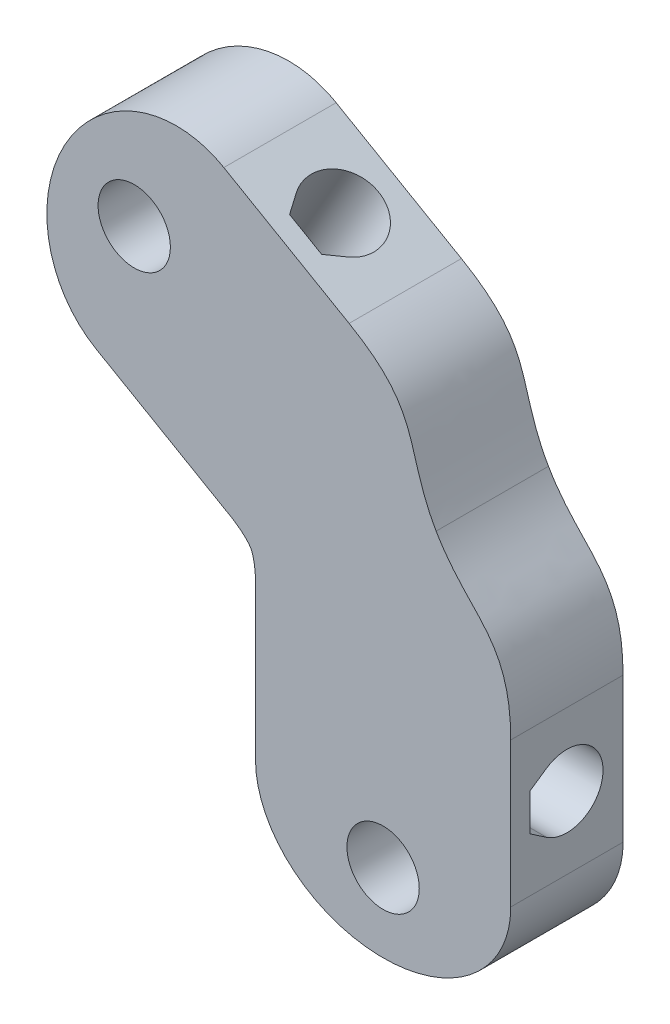
ISO-10303-21;
HEADER;
FILE_DESCRIPTION(('STEP AP214'),'2;1');
FILE_NAME('part.step','',(''),(''),'','','');
FILE_SCHEMA(('AUTOMOTIVE_DESIGN { 1 0 10303 214 1 1 1 1 }'));
ENDSEC;
DATA;
#1=APPLICATION_CONTEXT('core data for automotive mechanical design processes');
#2=APPLICATION_PROTOCOL_DEFINITION('international standard','automotive_design',2000,#1);
#3=PRODUCT_CONTEXT('',#1,'mechanical');
#4=PRODUCT('Part','Part','',(#3));
#5=PRODUCT_RELATED_PRODUCT_CATEGORY('part','',(#4));
#6=PRODUCT_DEFINITION_FORMATION('','',#4);
#7=PRODUCT_DEFINITION_CONTEXT('part definition',#1,'design');
#8=PRODUCT_DEFINITION('design','',#6,#7);
#9=PRODUCT_DEFINITION_SHAPE('','',#8);
#10=(LENGTH_UNIT() NAMED_UNIT(*) SI_UNIT(.MILLI.,.METRE.));
#11=(NAMED_UNIT(*) PLANE_ANGLE_UNIT() SI_UNIT($,.RADIAN.));
#12=(NAMED_UNIT(*) SI_UNIT($,.STERADIAN.) SOLID_ANGLE_UNIT());
#13=UNCERTAINTY_MEASURE_WITH_UNIT(LENGTH_MEASURE(1.E-05),#10,'distance_accuracy_value','');
#14=(GEOMETRIC_REPRESENTATION_CONTEXT(3) GLOBAL_UNCERTAINTY_ASSIGNED_CONTEXT((#13)) GLOBAL_UNIT_ASSIGNED_CONTEXT((#10,
#11,#12)) REPRESENTATION_CONTEXT('',''));
#15=CARTESIAN_POINT('',(0.,0.,0.));
#16=DIRECTION('',(0.,0.,1.));
#17=DIRECTION('',(1.,0.,0.));
#18=AXIS2_PLACEMENT_3D('',#15,#16,#17);
#19=CARTESIAN_POINT('',(0.,-30.2749907475931,6.6));
#20=DIRECTION('',(0.,0.,1.));
#21=DIRECTION('',(1.,0.,0.));
#22=AXIS2_PLACEMENT_3D('',#19,#20,#21);
#23=PLANE('',#22);
#24=DIRECTION('',(0.,-1.,0.));
#25=VECTOR('',#24,1.);
#26=CARTESIAN_POINT('',(-15.,-13.2749907475931,6.6));
#27=LINE('',#26,#25);
#28=CARTESIAN_POINT('',(-15.,-13.2749907475931,6.6));
#29=VERTEX_POINT('',#28);
#30=CARTESIAN_POINT('',(-15.,-30.2749907475931,6.6));
#31=VERTEX_POINT('',#30);
#32=EDGE_CURVE('E343',#29,#31,#27,.T.);
#33=ORIENTED_EDGE('',*,*,#32,.T.);
#34=CARTESIAN_POINT('',(0.,-30.2749907475931,6.6));
#35=DIRECTION('',(0.,0.,1.));
#36=DIRECTION('',(1.,0.,0.));
#37=AXIS2_PLACEMENT_3D('',#34,#35,#36);
#38=ELLIPSE('',#37,15.,12.681);
#39=CARTESIAN_POINT('',(15.,-30.2749907475932,6.6));
#40=VERTEX_POINT('',#39);
#41=EDGE_CURVE('E346',#31,#40,#38,.T.);
#42=ORIENTED_EDGE('',*,*,#41,.T.);
#43=DIRECTION('',(0.,-1.,0.));
#44=VECTOR('',#43,1.);
#45=CARTESIAN_POINT('',(15.,-13.2749907475933,6.6));
#46=LINE('',#45,#44);
#47=CARTESIAN_POINT('',(15.,-13.2749907475933,6.6));
#48=VERTEX_POINT('',#47);
#49=EDGE_CURVE('E350',#48,#40,#46,.T.);
#50=ORIENTED_EDGE('',*,*,#49,.F.);
#51=CARTESIAN_POINT('',(15.,-13.2749907475933,6.6));
#52=CARTESIAN_POINT('',(15.,-3.02796405891336,6.6));
#53=CARTESIAN_POINT('',(10.1063570974954,-3.10451473088878,6.6));
#54=CARTESIAN_POINT('',(6.2354735114352,3.60005231035195,6.6));
#55=B_SPLINE_CURVE_WITH_KNOTS('',3,(#51,#52,#53,#54),.UNSPECIFIED.,.F.,.F.,(4,4),(0.,1.),.UNSPECIFIED.);
#56=CARTESIAN_POINT('',(6.23547351143524,3.60005231035187,6.6));
#57=VERTEX_POINT('',#56);
#58=EDGE_CURVE('E367',#48,#57,#55,.T.);
#59=ORIENTED_EDGE('',*,*,#58,.T.);
#60=CARTESIAN_POINT('',(-3.99647922241902,19.6278764305633,6.6));
#61=CARTESIAN_POINT('',(4.87770620323494,14.5043630862233,6.6));
#62=CARTESIAN_POINT('',(2.36458992537499,10.3046193515926,6.6));
#63=CARTESIAN_POINT('',(6.23547351143524,3.60005231035187,6.6));
#64=B_SPLINE_CURVE_WITH_KNOTS('',3,(#60,#61,#62,#63),.UNSPECIFIED.,.F.,.F.,(4,4),(0.,1.),.UNSPECIFIED.);
#65=CARTESIAN_POINT('',(-3.99647922241902,19.6278764305633,6.6));
#66=VERTEX_POINT('',#65);
#67=EDGE_CURVE('E371',#66,#57,#64,.T.);
#68=ORIENTED_EDGE('',*,*,#67,.F.);
#69=DIRECTION('',(-0.866025403784441,0.499999999999996,0.));
#70=VECTOR('',#69,1.);
#71=CARTESIAN_POINT('',(-3.99647922241902,19.6278764305633,6.6));
#72=LINE('',#71,#70);
#73=CARTESIAN_POINT('',(-18.7189110867546,28.1278764305632,6.6));
#74=VERTEX_POINT('',#73);
#75=EDGE_CURVE('E380',#66,#74,#72,.T.);
#76=ORIENTED_EDGE('',*,*,#75,.T.);
#77=CARTESIAN_POINT('',(-26.2189110867545,15.1374953737965,6.6));
#78=DIRECTION('',(0.,0.,-1.));
#79=DIRECTION('',(0.49999999999999,0.866025403784445,0.));
#80=AXIS2_PLACEMENT_3D('',#77,#78,#79);
#81=ELLIPSE('',#80,15.,12.681);
#82=CARTESIAN_POINT('',(-33.7189110867545,2.14711431703005,6.6));
#83=VERTEX_POINT('',#82);
#84=EDGE_CURVE('E385',#83,#74,#81,.T.);
#85=ORIENTED_EDGE('',*,*,#84,.F.);
#86=DIRECTION('',(-0.866025403784438,0.500000000000002,0.));
#87=VECTOR('',#86,1.);
#88=CARTESIAN_POINT('',(-18.996479222419,-6.35288568297003,6.6));
#89=LINE('',#88,#87);
#90=CARTESIAN_POINT('',(-18.996479222419,-6.35288568297003,6.6));
#91=VERTEX_POINT('',#90);
#92=EDGE_CURVE('E389',#91,#83,#89,.T.);
#93=ORIENTED_EDGE('',*,*,#92,.F.);
#94=CARTESIAN_POINT('',(-18.996479222419,-6.35288568297003,6.6));
#95=CARTESIAN_POINT('',(-16.8990015137658,-7.4384009621155,6.6));
#96=CARTESIAN_POINT('',(-15.9160989893475,-8.40880751728888,6.6));
#97=CARTESIAN_POINT('',(-15.5781947047634,-8.99407490628362,6.6));
#98=B_SPLINE_CURVE_WITH_KNOTS('',3,(#94,#95,#96,#97),.UNSPECIFIED.,.F.,.F.,(4,4),(0.,1.),.UNSPECIFIED.);
#99=CARTESIAN_POINT('',(-15.5781947047634,-8.99407490628362,6.6));
#100=VERTEX_POINT('',#99);
#101=EDGE_CURVE('E431',#91,#100,#98,.T.);
#102=ORIENTED_EDGE('',*,*,#101,.T.);
#103=CARTESIAN_POINT('',(-15.,-13.2749907475931,6.6));
#104=CARTESIAN_POINT('',(-14.8913449536095,-10.9157641284551,6.6));
#105=CARTESIAN_POINT('',(-15.2402904201794,-9.57934229527836,6.6));
#106=CARTESIAN_POINT('',(-15.5781947047634,-8.99407490628362,6.6));
#107=B_SPLINE_CURVE_WITH_KNOTS('',3,(#103,#104,#105,#106),.UNSPECIFIED.,.F.,.F.,(4,4),(0.,1.),.UNSPECIFIED.);
#108=EDGE_CURVE('E424',#29,#100,#107,.T.);
#109=ORIENTED_EDGE('',*,*,#108,.F.);
#110=EDGE_LOOP('',(#33,#42,#50,#59,#68,#76,#85,#93,#102,#109));
#111=FACE_BOUND('',#110,.T.);
#112=CARTESIAN_POINT('',(-29.25,16.8874953737966,6.6));
#113=DIRECTION('',(0.,0.,1.));
#114=DIRECTION('',(1.,0.,0.));
#115=AXIS2_PLACEMENT_3D('',#112,#113,#114);
#116=CIRCLE('',#115,4.25000000000001);
#117=CARTESIAN_POINT('',(-25.,16.8874953737966,6.6));
#118=VERTEX_POINT('',#117);
#119=EDGE_CURVE('E337',#118,#118,#116,.F.);
#120=ORIENTED_EDGE('',*,*,#119,.T.);
#121=EDGE_LOOP('',(#120));
#122=FACE_BOUND('',#121,.T.);
#123=CARTESIAN_POINT('',(0.,-33.7749907475931,6.6));
#124=DIRECTION('',(0.,0.,1.));
#125=DIRECTION('',(1.,0.,0.));
#126=AXIS2_PLACEMENT_3D('',#123,#124,#125);
#127=CIRCLE('',#126,4.25000000000001);
#128=CARTESIAN_POINT('',(4.25000000000001,-33.7749907475931,6.6));
#129=VERTEX_POINT('',#128);
#130=EDGE_CURVE('E331',#129,#129,#127,.T.);
#131=ORIENTED_EDGE('',*,*,#130,.F.);
#132=EDGE_LOOP('',(#131));
#133=FACE_BOUND('',#132,.T.);
#134=ADVANCED_FACE('F139',(#111,#122,#133),#23,.T.);
#135=CARTESIAN_POINT('',(0.,-30.2749907475931,-6.6));
#136=DIRECTION('',(0.,0.,1.));
#137=DIRECTION('',(1.,0.,0.));
#138=AXIS2_PLACEMENT_3D('',#135,#136,#137);
#139=PLANE('',#138);
#140=CARTESIAN_POINT('',(-29.25,16.8874953737966,-6.6));
#141=DIRECTION('',(0.,0.,1.));
#142=DIRECTION('',(1.,0.,0.));
#143=AXIS2_PLACEMENT_3D('',#140,#141,#142);
#144=CIRCLE('',#143,4.25000000000001);
#145=CARTESIAN_POINT('',(-25.,16.8874953737966,-6.6));
#146=VERTEX_POINT('',#145);
#147=EDGE_CURVE('E334',#146,#146,#144,.F.);
#148=ORIENTED_EDGE('',*,*,#147,.F.);
#149=EDGE_LOOP('',(#148));
#150=FACE_BOUND('',#149,.T.);
#151=DIRECTION('',(0.,-1.,0.));
#152=VECTOR('',#151,1.);
#153=CARTESIAN_POINT('',(-15.,-13.2749907475931,-6.6));
#154=LINE('',#153,#152);
#155=CARTESIAN_POINT('',(-15.,-13.2749907475931,-6.6));
#156=VERTEX_POINT('',#155);
#157=CARTESIAN_POINT('',(-15.,-30.2749907475931,-6.6));
#158=VERTEX_POINT('',#157);
#159=EDGE_CURVE('E340',#156,#158,#154,.T.);
#160=ORIENTED_EDGE('',*,*,#159,.F.);
#161=CARTESIAN_POINT('',(-15.,-13.2749907475931,-6.6));
#162=CARTESIAN_POINT('',(-14.8913449536095,-10.9157641284551,-6.6));
#163=CARTESIAN_POINT('',(-15.2402904201794,-9.57934229527836,-6.6));
#164=CARTESIAN_POINT('',(-15.5781947047634,-8.99407490628362,-6.6));
#165=B_SPLINE_CURVE_WITH_KNOTS('',3,(#161,#162,#163,#164),.UNSPECIFIED.,.F.,.F.,(4,4),(0.,1.),.UNSPECIFIED.);
#166=CARTESIAN_POINT('',(-15.5781947047634,-8.99407490628362,-6.6));
#167=VERTEX_POINT('',#166);
#168=EDGE_CURVE('E347',#156,#167,#165,.T.);
#169=ORIENTED_EDGE('',*,*,#168,.T.);
#170=CARTESIAN_POINT('',(-18.996479222419,-6.35288568297003,-6.6));
#171=CARTESIAN_POINT('',(-16.8990015137658,-7.4384009621155,-6.6));
#172=CARTESIAN_POINT('',(-15.9160989893475,-8.40880751728888,-6.6));
#173=CARTESIAN_POINT('',(-15.5781947047634,-8.99407490628362,-6.6));
#174=B_SPLINE_CURVE_WITH_KNOTS('',3,(#170,#171,#172,#173),.UNSPECIFIED.,.F.,.F.,(4,4),(0.,1.),.UNSPECIFIED.);
#175=CARTESIAN_POINT('',(-18.996479222419,-6.35288568297003,-6.6));
#176=VERTEX_POINT('',#175);
#177=EDGE_CURVE('E471',#176,#167,#174,.T.);
#178=ORIENTED_EDGE('',*,*,#177,.F.);
#179=DIRECTION('',(-0.866025403784438,0.500000000000002,0.));
#180=VECTOR('',#179,1.);
#181=CARTESIAN_POINT('',(-18.996479222419,-6.35288568297003,-6.6));
#182=LINE('',#181,#180);
#183=CARTESIAN_POINT('',(-33.7189110867545,2.14711431703005,-6.6));
#184=VERTEX_POINT('',#183);
#185=EDGE_CURVE('E468',#176,#184,#182,.T.);
#186=ORIENTED_EDGE('',*,*,#185,.T.);
#187=CARTESIAN_POINT('',(-26.2189110867545,15.1374953737965,-6.6));
#188=DIRECTION('',(0.,0.,-1.));
#189=DIRECTION('',(0.49999999999999,0.866025403784445,0.));
#190=AXIS2_PLACEMENT_3D('',#187,#188,#189);
#191=ELLIPSE('',#190,15.,12.681);
#192=CARTESIAN_POINT('',(-18.7189110867546,28.1278764305632,-6.6));
#193=VERTEX_POINT('',#192);
#194=EDGE_CURVE('E465',#184,#193,#191,.T.);
#195=ORIENTED_EDGE('',*,*,#194,.T.);
#196=DIRECTION('',(-0.866025403784441,0.499999999999996,0.));
#197=VECTOR('',#196,1.);
#198=CARTESIAN_POINT('',(-3.99647922241902,19.6278764305633,-6.6));
#199=LINE('',#198,#197);
#200=CARTESIAN_POINT('',(-3.99647922241902,19.6278764305633,-6.6));
#201=VERTEX_POINT('',#200);
#202=EDGE_CURVE('E459',#201,#193,#199,.T.);
#203=ORIENTED_EDGE('',*,*,#202,.F.);
#204=CARTESIAN_POINT('',(-3.99647922241902,19.6278764305633,-6.6));
#205=CARTESIAN_POINT('',(4.87770620323494,14.5043630862233,-6.6));
#206=CARTESIAN_POINT('',(2.36458992537499,10.3046193515926,-6.6));
#207=CARTESIAN_POINT('',(6.23547351143524,3.60005231035187,-6.6));
#208=B_SPLINE_CURVE_WITH_KNOTS('',3,(#204,#205,#206,#207),.UNSPECIFIED.,.F.,.F.,(4,4),(0.,1.),.UNSPECIFIED.);
#209=CARTESIAN_POINT('',(6.23547351143524,3.60005231035187,-6.6));
#210=VERTEX_POINT('',#209);
#211=EDGE_CURVE('E451',#201,#210,#208,.T.);
#212=ORIENTED_EDGE('',*,*,#211,.T.);
#213=CARTESIAN_POINT('',(15.,-13.2749907475933,-6.6));
#214=CARTESIAN_POINT('',(15.,-3.02796405891336,-6.6));
#215=CARTESIAN_POINT('',(10.1063570974954,-3.10451473088878,-6.6));
#216=CARTESIAN_POINT('',(6.2354735114352,3.60005231035195,-6.6));
#217=B_SPLINE_CURVE_WITH_KNOTS('',3,(#213,#214,#215,#216),.UNSPECIFIED.,.F.,.F.,(4,4),(0.,1.),.UNSPECIFIED.);
#218=CARTESIAN_POINT('',(15.,-13.2749907475933,-6.6));
#219=VERTEX_POINT('',#218);
#220=EDGE_CURVE('E446',#219,#210,#217,.T.);
#221=ORIENTED_EDGE('',*,*,#220,.F.);
#222=DIRECTION('',(0.,-1.,0.));
#223=VECTOR('',#222,1.);
#224=CARTESIAN_POINT('',(15.,-13.2749907475933,-6.6));
#225=LINE('',#224,#223);
#226=CARTESIAN_POINT('',(15.,-30.2749907475932,-6.6));
#227=VERTEX_POINT('',#226);
#228=EDGE_CURVE('E443',#219,#227,#225,.T.);
#229=ORIENTED_EDGE('',*,*,#228,.T.);
#230=CARTESIAN_POINT('',(0.,-30.2749907475931,-6.6));
#231=DIRECTION('',(0.,0.,1.));
#232=DIRECTION('',(1.,0.,0.));
#233=AXIS2_PLACEMENT_3D('',#230,#231,#232);
#234=ELLIPSE('',#233,15.,12.681);
#235=EDGE_CURVE('E440',#158,#227,#234,.T.);
#236=ORIENTED_EDGE('',*,*,#235,.F.);
#237=EDGE_LOOP('',(#160,#169,#178,#186,#195,#203,#212,#221,#229,#236));
#238=FACE_BOUND('',#237,.T.);
#239=CARTESIAN_POINT('',(0.,-33.7749907475931,-6.6));
#240=DIRECTION('',(0.,0.,1.));
#241=DIRECTION('',(1.,0.,0.));
#242=AXIS2_PLACEMENT_3D('',#239,#240,#241);
#243=CIRCLE('',#242,4.25000000000001);
#244=CARTESIAN_POINT('',(4.25000000000001,-33.7749907475931,-6.6));
#245=VERTEX_POINT('',#244);
#246=EDGE_CURVE('E330',#245,#245,#243,.T.);
#247=ORIENTED_EDGE('',*,*,#246,.T.);
#248=EDGE_LOOP('',(#247));
#249=FACE_BOUND('',#248,.T.);
#250=ADVANCED_FACE('F406',(#150,#238,#249),#139,.F.);
#251=CARTESIAN_POINT('',(-15.,-13.2749907475931,6.6));
#252=DIRECTION('',(1.,0.,0.));
#253=DIRECTION('',(0.,1.,0.));
#254=AXIS2_PLACEMENT_3D('',#251,#252,#253);
#255=PLANE('',#254);
#256=DIRECTION('',(0.,-1.,0.));
#257=VECTOR('',#256,1.);
#258=CARTESIAN_POINT('',(-15.,-23.9499907475933,4.35));
#259=LINE('',#258,#257);
#260=CARTESIAN_POINT('',(-15.,-19.5999907475933,4.35));
#261=VERTEX_POINT('',#260);
#262=CARTESIAN_POINT('',(-15.,-23.9499907475933,4.35));
#263=VERTEX_POINT('',#262);
#264=EDGE_CURVE('E301',#261,#263,#259,.T.);
#265=ORIENTED_EDGE('',*,*,#264,.T.);
#266=DIRECTION('',(0.,0.564188482461599,0.825646023582551));
#267=VECTOR('',#266,1.);
#268=CARTESIAN_POINT('',(-15.,-23.9499907475933,4.34999999999999));
#269=LINE('',#268,#267);
#270=CARTESIAN_POINT('',(-15.,-25.2839863478191,2.39780105046179));
#271=VERTEX_POINT('',#270);
#272=EDGE_CURVE('E304',#271,#263,#269,.T.);
#273=ORIENTED_EDGE('',*,*,#272,.F.);
#274=CARTESIAN_POINT('',(-15.,-21.7749907475933,0.));
#275=DIRECTION('',(1.,0.,0.));
#276=DIRECTION('',(0.,1.,0.));
#277=AXIS2_PLACEMENT_3D('',#274,#275,#276);
#278=CIRCLE('',#277,4.25);
#279=CARTESIAN_POINT('',(-15.,-18.2659951473674,2.39780105046179));
#280=VERTEX_POINT('',#279);
#281=EDGE_CURVE('E321',#280,#271,#278,.F.);
#282=ORIENTED_EDGE('',*,*,#281,.F.);
#283=DIRECTION('',(0.,-0.564188482461599,0.825646023582551));
#284=VECTOR('',#283,1.);
#285=CARTESIAN_POINT('',(-15.,-19.5999907475933,4.35000000000001));
#286=LINE('',#285,#284);
#287=EDGE_CURVE('E270',#280,#261,#286,.T.);
#288=ORIENTED_EDGE('',*,*,#287,.T.);
#289=EDGE_LOOP('',(#265,#273,#282,#288));
#290=FACE_BOUND('',#289,.T.);
#291=ORIENTED_EDGE('',*,*,#159,.T.);
#292=DIRECTION('',(0.,0.,-1.));
#293=VECTOR('',#292,1.);
#294=CARTESIAN_POINT('',(-15.,-30.2749907475931,6.6));
#295=LINE('',#294,#293);
#296=EDGE_CURVE('E12',#31,#158,#295,.T.);
#297=ORIENTED_EDGE('',*,*,#296,.F.);
#298=ORIENTED_EDGE('',*,*,#32,.F.);
#299=DIRECTION('',(0.,0.,-1.));
#300=VECTOR('',#299,1.);
#301=CARTESIAN_POINT('',(-15.,-13.2749907475931,6.6));
#302=LINE('',#301,#300);
#303=EDGE_CURVE('E430',#29,#156,#302,.T.);
#304=ORIENTED_EDGE('',*,*,#303,.T.);
#305=EDGE_LOOP('',(#291,#297,#298,#304));
#306=FACE_BOUND('',#305,.T.);
#307=ADVANCED_FACE('F141',(#290,#306),#255,.F.);
#308=DIRECTION('',(0.,0.,-1.));
#309=VECTOR('',#308,1.);
#310=SURFACE_OF_LINEAR_EXTRUSION('',#38,#309);
#311=ORIENTED_EDGE('',*,*,#235,.T.);
#312=DIRECTION('',(0.,0.,-1.));
#313=VECTOR('',#312,1.);
#314=CARTESIAN_POINT('',(15.,-30.2749907475932,6.6));
#315=LINE('',#314,#313);
#316=EDGE_CURVE('E147',#40,#227,#315,.T.);
#317=ORIENTED_EDGE('',*,*,#316,.F.);
#318=ORIENTED_EDGE('',*,*,#41,.F.);
#319=ORIENTED_EDGE('',*,*,#296,.T.);
#320=EDGE_LOOP('',(#311,#317,#318,#319));
#321=FACE_BOUND('',#320,.T.);
#322=ADVANCED_FACE('F352',(#321),#310,.F.);
#323=CARTESIAN_POINT('',(15.,-13.2749907475933,6.6));
#324=DIRECTION('',(1.,0.,0.));
#325=DIRECTION('',(0.,1.,0.));
#326=AXIS2_PLACEMENT_3D('',#323,#324,#325);
#327=PLANE('',#326);
#328=DIRECTION('',(0.,-0.564188482461599,-0.825646023582551));
#329=VECTOR('',#328,1.);
#330=CARTESIAN_POINT('',(15.,-23.9499907475932,4.35));
#331=LINE('',#330,#329);
#332=CARTESIAN_POINT('',(15.,-23.9499907475932,4.35));
#333=VERTEX_POINT('',#332);
#334=CARTESIAN_POINT('',(15.,-25.2839863478191,2.39780105046179));
#335=VERTEX_POINT('',#334);
#336=EDGE_CURVE('E307',#333,#335,#331,.T.);
#337=ORIENTED_EDGE('',*,*,#336,.F.);
#338=DIRECTION('',(0.,1.,0.));
#339=VECTOR('',#338,1.);
#340=CARTESIAN_POINT('',(15.,-23.9499907475932,4.35));
#341=LINE('',#340,#339);
#342=CARTESIAN_POINT('',(15.,-19.5999907475932,4.35));
#343=VERTEX_POINT('',#342);
#344=EDGE_CURVE('E315',#333,#343,#341,.T.);
#345=ORIENTED_EDGE('',*,*,#344,.T.);
#346=DIRECTION('',(0.,0.564188482461599,-0.825646023582551));
#347=VECTOR('',#346,1.);
#348=CARTESIAN_POINT('',(15.,-19.5999907475932,4.35));
#349=LINE('',#348,#347);
#350=CARTESIAN_POINT('',(15.,-18.2659951473674,2.39780105046179));
#351=VERTEX_POINT('',#350);
#352=EDGE_CURVE('E312',#343,#351,#349,.T.);
#353=ORIENTED_EDGE('',*,*,#352,.T.);
#354=CARTESIAN_POINT('',(15.,-21.7749907475932,0.));
#355=DIRECTION('',(1.,0.,0.));
#356=DIRECTION('',(0.,1.,0.));
#357=AXIS2_PLACEMENT_3D('',#354,#355,#356);
#358=CIRCLE('',#357,4.25);
#359=EDGE_CURVE('E309',#335,#351,#358,.T.);
#360=ORIENTED_EDGE('',*,*,#359,.F.);
#361=EDGE_LOOP('',(#337,#345,#353,#360));
#362=FACE_BOUND('',#361,.T.);
#363=ORIENTED_EDGE('',*,*,#228,.F.);
#364=DIRECTION('',(0.,0.,-1.));
#365=VECTOR('',#364,1.);
#366=CARTESIAN_POINT('',(15.,-13.2749907475933,6.6));
#367=LINE('',#366,#365);
#368=EDGE_CURVE('E499',#48,#219,#367,.T.);
#369=ORIENTED_EDGE('',*,*,#368,.F.);
#370=ORIENTED_EDGE('',*,*,#49,.T.);
#371=ORIENTED_EDGE('',*,*,#316,.T.);
#372=EDGE_LOOP('',(#363,#369,#370,#371));
#373=FACE_BOUND('',#372,.T.);
#374=ADVANCED_FACE('F355',(#362,#373),#327,.T.);
#375=DIRECTION('',(0.,0.,-1.));
#376=VECTOR('',#375,1.);
#377=SURFACE_OF_LINEAR_EXTRUSION('',#55,#376);
#378=ORIENTED_EDGE('',*,*,#220,.T.);
#379=DIRECTION('',(0.,0.,-1.));
#380=VECTOR('',#379,1.);
#381=CARTESIAN_POINT('',(6.23547351143524,3.60005231035187,6.6));
#382=LINE('',#381,#380);
#383=EDGE_CURVE('E497',#57,#210,#382,.T.);
#384=ORIENTED_EDGE('',*,*,#383,.F.);
#385=ORIENTED_EDGE('',*,*,#58,.F.);
#386=ORIENTED_EDGE('',*,*,#368,.T.);
#387=EDGE_LOOP('',(#378,#384,#385,#386));
#388=FACE_BOUND('',#387,.T.);
#389=ADVANCED_FACE('F359',(#388),#377,.F.);
#390=DIRECTION('',(0.,0.,-1.));
#391=VECTOR('',#390,1.);
#392=SURFACE_OF_LINEAR_EXTRUSION('',#64,#391);
#393=ORIENTED_EDGE('',*,*,#211,.F.);
#394=DIRECTION('',(0.,0.,-1.));
#395=VECTOR('',#394,1.);
#396=CARTESIAN_POINT('',(-3.99647922241902,19.6278764305633,6.6));
#397=LINE('',#396,#395);
#398=EDGE_CURVE('E495',#66,#201,#397,.T.);
#399=ORIENTED_EDGE('',*,*,#398,.F.);
#400=ORIENTED_EDGE('',*,*,#67,.T.);
#401=ORIENTED_EDGE('',*,*,#383,.T.);
#402=EDGE_LOOP('',(#393,#399,#400,#401));
#403=FACE_BOUND('',#402,.T.);
#404=ADVANCED_FACE('F363',(#403),#392,.T.);
#405=CARTESIAN_POINT('',(-3.99647922241902,19.6278764305633,6.6));
#406=DIRECTION('',(-0.499999999999996,-0.866025403784441,0.));
#407=DIRECTION('',(0.866025403784441,-0.499999999999996,0.));
#408=AXIS2_PLACEMENT_3D('',#405,#406,#407);
#409=PLANE('',#408);
#410=CARTESIAN_POINT('',(-11.3576951545868,23.8778764305632,0.));
#411=DIRECTION('',(0.499999999999996,0.866025403784441,0.));
#412=DIRECTION('',(-0.866025403784441,0.499999999999996,0.));
#413=AXIS2_PLACEMENT_3D('',#410,#411,#412);
#414=CIRCLE('',#413,4.25);
#415=CARTESIAN_POINT('',(-8.31881582302338,22.1233786304503,2.39780105046179));
#416=VERTEX_POINT('',#415);
#417=CARTESIAN_POINT('',(-14.3965744861502,25.6323742306761,2.39780105046179));
#418=VERTEX_POINT('',#417);
#419=EDGE_CURVE('E283',#416,#418,#414,.T.);
#420=ORIENTED_EDGE('',*,*,#419,.F.);
#421=DIRECTION('',(0.488601558334337,-0.282094241230797,-0.825646023582551));
#422=VECTOR('',#421,1.);
#423=CARTESIAN_POINT('',(-9.47408990135564,22.7903764305632,4.35));
#424=LINE('',#423,#422);
#425=CARTESIAN_POINT('',(-9.47408990135564,22.7903764305632,4.35));
#426=VERTEX_POINT('',#425);
#427=EDGE_CURVE('E154',#426,#416,#424,.T.);
#428=ORIENTED_EDGE('',*,*,#427,.F.);
#429=DIRECTION('',(-0.866025403784441,0.499999999999996,0.));
#430=VECTOR('',#429,1.);
#431=CARTESIAN_POINT('',(-9.47408990135564,22.7903764305632,4.35));
#432=LINE('',#431,#430);
#433=CARTESIAN_POINT('',(-13.241300407818,24.9653764305632,4.35));
#434=VERTEX_POINT('',#433);
#435=EDGE_CURVE('E276',#426,#434,#432,.T.);
#436=ORIENTED_EDGE('',*,*,#435,.T.);
#437=DIRECTION('',(-0.488601558334337,0.282094241230796,-0.825646023582551));
#438=VECTOR('',#437,1.);
#439=CARTESIAN_POINT('',(-13.241300407818,24.9653764305632,4.35));
#440=LINE('',#439,#438);
#441=EDGE_CURVE('E290',#434,#418,#440,.T.);
#442=ORIENTED_EDGE('',*,*,#441,.T.);
#443=EDGE_LOOP('',(#420,#428,#436,#442));
#444=FACE_BOUND('',#443,.T.);
#445=ORIENTED_EDGE('',*,*,#202,.T.);
#446=DIRECTION('',(0.,0.,-1.));
#447=VECTOR('',#446,1.);
#448=CARTESIAN_POINT('',(-18.7189110867546,28.1278764305632,6.6));
#449=LINE('',#448,#447);
#450=EDGE_CURVE('E493',#74,#193,#449,.T.);
#451=ORIENTED_EDGE('',*,*,#450,.F.);
#452=ORIENTED_EDGE('',*,*,#75,.F.);
#453=ORIENTED_EDGE('',*,*,#398,.T.);
#454=EDGE_LOOP('',(#445,#451,#452,#453));
#455=FACE_BOUND('',#454,.T.);
#456=ADVANCED_FACE('F395',(#444,#455),#409,.F.);
#457=DIRECTION('',(0.,0.,-1.));
#458=VECTOR('',#457,1.);
#459=SURFACE_OF_LINEAR_EXTRUSION('',#81,#458);
#460=ORIENTED_EDGE('',*,*,#194,.F.);
#461=DIRECTION('',(0.,0.,-1.));
#462=VECTOR('',#461,1.);
#463=CARTESIAN_POINT('',(-33.7189110867545,2.14711431703005,6.6));
#464=LINE('',#463,#462);
#465=EDGE_CURVE('E491',#83,#184,#464,.T.);
#466=ORIENTED_EDGE('',*,*,#465,.F.);
#467=ORIENTED_EDGE('',*,*,#84,.T.);
#468=ORIENTED_EDGE('',*,*,#450,.T.);
#469=EDGE_LOOP('',(#460,#466,#467,#468));
#470=FACE_BOUND('',#469,.T.);
#471=ADVANCED_FACE('F392',(#470),#459,.T.);
#472=CARTESIAN_POINT('',(-18.996479222419,-6.35288568297003,6.6));
#473=DIRECTION('',(-0.500000000000002,-0.866025403784438,0.));
#474=DIRECTION('',(0.866025403784438,-0.500000000000002,0.));
#475=AXIS2_PLACEMENT_3D('',#472,#473,#474);
#476=PLANE('',#475);
#477=DIRECTION('',(0.488601558334335,-0.282094241230801,-0.825646023582551));
#478=VECTOR('',#477,1.);
#479=CARTESIAN_POINT('',(-24.4740899013554,-3.19038568297006,4.34999999999986));
#480=LINE('',#479,#478);
#481=CARTESIAN_POINT('',(-24.4740899013555,-3.19038568297002,4.35));
#482=VERTEX_POINT('',#481);
#483=CARTESIAN_POINT('',(-23.3188158230233,-3.85738348308295,2.39780105046179));
#484=VERTEX_POINT('',#483);
#485=EDGE_CURVE('E274',#482,#484,#480,.T.);
#486=ORIENTED_EDGE('',*,*,#485,.T.);
#487=CARTESIAN_POINT('',(-26.3576951545867,-2.10288568297002,0.));
#488=DIRECTION('',(-0.500000000000002,-0.866025403784438,0.));
#489=DIRECTION('',(0.866025403784438,-0.500000000000002,0.));
#490=AXIS2_PLACEMENT_3D('',#487,#488,#489);
#491=CIRCLE('',#490,4.25);
#492=CARTESIAN_POINT('',(-29.3965744861501,-0.348387882857091,2.39780105046179));
#493=VERTEX_POINT('',#492);
#494=EDGE_CURVE('E263',#484,#493,#491,.F.);
#495=ORIENTED_EDGE('',*,*,#494,.T.);
#496=DIRECTION('',(-0.488601558334335,0.2820942412308,-0.825646023582551));
#497=VECTOR('',#496,1.);
#498=CARTESIAN_POINT('',(-28.2413004078177,-1.01538568297006,4.35000000000014));
#499=LINE('',#498,#497);
#500=CARTESIAN_POINT('',(-28.2413004078178,-1.01538568297001,4.35));
#501=VERTEX_POINT('',#500);
#502=EDGE_CURVE('E285',#501,#493,#499,.T.);
#503=ORIENTED_EDGE('',*,*,#502,.F.);
#504=DIRECTION('',(-0.866025403784438,0.500000000000002,0.));
#505=VECTOR('',#504,1.);
#506=CARTESIAN_POINT('',(-24.4740899013553,-3.19038568297018,4.35));
#507=LINE('',#506,#505);
#508=EDGE_CURVE('E281',#482,#501,#507,.T.);
#509=ORIENTED_EDGE('',*,*,#508,.F.);
#510=EDGE_LOOP('',(#486,#495,#503,#509));
#511=FACE_BOUND('',#510,.T.);
#512=ORIENTED_EDGE('',*,*,#185,.F.);
#513=DIRECTION('',(0.,0.,-1.));
#514=VECTOR('',#513,1.);
#515=CARTESIAN_POINT('',(-18.996479222419,-6.35288568297003,6.6));
#516=LINE('',#515,#514);
#517=EDGE_CURVE('E489',#91,#176,#516,.T.);
#518=ORIENTED_EDGE('',*,*,#517,.F.);
#519=ORIENTED_EDGE('',*,*,#92,.T.);
#520=ORIENTED_EDGE('',*,*,#465,.T.);
#521=EDGE_LOOP('',(#512,#518,#519,#520));
#522=FACE_BOUND('',#521,.T.);
#523=ADVANCED_FACE('F279',(#511,#522),#476,.T.);
#524=DIRECTION('',(0.,0.,-1.));
#525=VECTOR('',#524,1.);
#526=SURFACE_OF_LINEAR_EXTRUSION('',#98,#525);
#527=ORIENTED_EDGE('',*,*,#177,.T.);
#528=DIRECTION('',(0.,0.,-1.));
#529=VECTOR('',#528,1.);
#530=CARTESIAN_POINT('',(-15.5781947047634,-8.99407490628362,6.6));
#531=LINE('',#530,#529);
#532=EDGE_CURVE('E487',#100,#167,#531,.T.);
#533=ORIENTED_EDGE('',*,*,#532,.F.);
#534=ORIENTED_EDGE('',*,*,#101,.F.);
#535=ORIENTED_EDGE('',*,*,#517,.T.);
#536=EDGE_LOOP('',(#527,#533,#534,#535));
#537=FACE_BOUND('',#536,.T.);
#538=ADVANCED_FACE('F422',(#537),#526,.F.);
#539=DIRECTION('',(0.,0.,-1.));
#540=VECTOR('',#539,1.);
#541=SURFACE_OF_LINEAR_EXTRUSION('',#107,#540);
#542=ORIENTED_EDGE('',*,*,#168,.F.);
#543=ORIENTED_EDGE('',*,*,#303,.F.);
#544=ORIENTED_EDGE('',*,*,#108,.T.);
#545=ORIENTED_EDGE('',*,*,#532,.T.);
#546=EDGE_LOOP('',(#542,#543,#544,#545));
#547=FACE_BOUND('',#546,.T.);
#548=ADVANCED_FACE('F419',(#547),#541,.T.);
#549=CARTESIAN_POINT('',(-29.25,16.8874953737966,6.6));
#550=DIRECTION('',(0.,0.,-1.));
#551=DIRECTION('',(-1.,0.,0.));
#552=AXIS2_PLACEMENT_3D('',#549,#550,#551);
#553=CYLINDRICAL_SURFACE('',#552,4.25000000000001);
#554=ORIENTED_EDGE('',*,*,#119,.F.);
#555=EDGE_LOOP('',(#554));
#556=FACE_BOUND('',#555,.T.);
#557=ORIENTED_EDGE('',*,*,#147,.T.);
#558=EDGE_LOOP('',(#557));
#559=FACE_BOUND('',#558,.T.);
#560=ADVANCED_FACE('F416',(#556,#559),#553,.F.);
#561=CARTESIAN_POINT('',(0.,-33.7749907475931,6.6));
#562=DIRECTION('',(0.,0.,-1.));
#563=DIRECTION('',(-1.,0.,0.));
#564=AXIS2_PLACEMENT_3D('',#561,#562,#563);
#565=CYLINDRICAL_SURFACE('',#564,4.25000000000001);
#566=ORIENTED_EDGE('',*,*,#130,.T.);
#567=EDGE_LOOP('',(#566));
#568=FACE_BOUND('',#567,.T.);
#569=ORIENTED_EDGE('',*,*,#246,.F.);
#570=EDGE_LOOP('',(#569));
#571=FACE_BOUND('',#570,.T.);
#572=ADVANCED_FACE('F547',(#568,#571),#565,.F.);
#573=CARTESIAN_POINT('',(-39.5186260904682,-23.9499907475933,4.35));
#574=DIRECTION('',(0.,-0.825646023582551,0.564188482461599));
#575=DIRECTION('',(0.,-0.564188482461599,-0.825646023582551));
#576=AXIS2_PLACEMENT_3D('',#573,#574,#575);
#577=PLANE('',#576);
#578=ORIENTED_EDGE('',*,*,#272,.T.);
#579=DIRECTION('',(1.,0.,0.));
#580=VECTOR('',#579,1.);
#581=CARTESIAN_POINT('',(-39.5186260904682,-23.9499907475933,4.35));
#582=LINE('',#581,#580);
#583=EDGE_CURVE('E319',#263,#333,#582,.T.);
#584=ORIENTED_EDGE('',*,*,#583,.T.);
#585=ORIENTED_EDGE('',*,*,#336,.T.);
#586=DIRECTION('',(1.,0.,0.));
#587=VECTOR('',#586,1.);
#588=CARTESIAN_POINT('',(-39.5186260904682,-25.2839863478191,2.39780105046179));
#589=LINE('',#588,#587);
#590=EDGE_CURVE('E318',#271,#335,#589,.T.);
#591=ORIENTED_EDGE('',*,*,#590,.F.);
#592=EDGE_LOOP('',(#578,#584,#585,#591));
#593=FACE_BOUND('',#592,.T.);
#594=ADVANCED_FACE('F554',(#593),#577,.F.);
#595=CARTESIAN_POINT('',(-39.5186260904682,-23.9499907475933,4.35));
#596=DIRECTION('',(0.,0.,-1.));
#597=DIRECTION('',(-1.,0.,0.));
#598=AXIS2_PLACEMENT_3D('',#595,#596,#597);
#599=PLANE('',#598);
#600=DIRECTION('',(1.,0.,0.));
#601=VECTOR('',#600,1.);
#602=CARTESIAN_POINT('',(-39.5186260904682,-19.5999907475933,4.35));
#603=LINE('',#602,#601);
#604=EDGE_CURVE('E322',#261,#343,#603,.T.);
#605=ORIENTED_EDGE('',*,*,#604,.T.);
#606=ORIENTED_EDGE('',*,*,#344,.F.);
#607=ORIENTED_EDGE('',*,*,#583,.F.);
#608=ORIENTED_EDGE('',*,*,#264,.F.);
#609=EDGE_LOOP('',(#605,#606,#607,#608));
#610=FACE_BOUND('',#609,.T.);
#611=ADVANCED_FACE('F562',(#610),#599,.T.);
#612=CARTESIAN_POINT('',(-39.5186260904682,-19.5999907475933,4.35));
#613=DIRECTION('',(0.,-0.825646023582551,-0.564188482461599));
#614=DIRECTION('',(0.,0.564188482461599,-0.825646023582551));
#615=AXIS2_PLACEMENT_3D('',#612,#613,#614);
#616=PLANE('',#615);
#617=DIRECTION('',(1.,0.,0.));
#618=VECTOR('',#617,1.);
#619=CARTESIAN_POINT('',(-39.5186260904682,-18.2659951473675,2.39780105046179));
#620=LINE('',#619,#618);
#621=EDGE_CURVE('E324',#280,#351,#620,.T.);
#622=ORIENTED_EDGE('',*,*,#621,.T.);
#623=ORIENTED_EDGE('',*,*,#352,.F.);
#624=ORIENTED_EDGE('',*,*,#604,.F.);
#625=ORIENTED_EDGE('',*,*,#287,.F.);
#626=EDGE_LOOP('',(#622,#623,#624,#625));
#627=FACE_BOUND('',#626,.T.);
#628=ADVANCED_FACE('F571',(#627),#616,.T.);
#629=CARTESIAN_POINT('',(-39.5186260904682,-21.7749907475933,0.));
#630=DIRECTION('',(1.,0.,0.));
#631=DIRECTION('',(0.,1.,0.));
#632=AXIS2_PLACEMENT_3D('',#629,#630,#631);
#633=CYLINDRICAL_SURFACE('',#632,4.25);
#634=ORIENTED_EDGE('',*,*,#281,.T.);
#635=ORIENTED_EDGE('',*,*,#590,.T.);
#636=ORIENTED_EDGE('',*,*,#359,.T.);
#637=ORIENTED_EDGE('',*,*,#621,.F.);
#638=EDGE_LOOP('',(#634,#635,#636,#637));
#639=FACE_BOUND('',#638,.T.);
#640=ADVANCED_FACE('F579',(#639),#633,.F.);
#641=CARTESIAN_POINT('',(-45.4546690527468,-39.5298147454004,4.35));
#642=DIRECTION('',(0.715030430956097,-0.412823011791272,0.564188482461599));
#643=DIRECTION('',(0.619435116776673,0.,-0.78504785593228));
#644=AXIS2_PLACEMENT_3D('',#641,#642,#643);
#645=PLANE('',#644);
#646=DIRECTION('',(0.499999999999996,0.866025403784441,0.));
#647=VECTOR('',#646,1.);
#648=CARTESIAN_POINT('',(-45.4546690527468,-39.5298147454004,4.35));
#649=LINE('',#648,#647);
#650=EDGE_CURVE('E271',#482,#426,#649,.T.);
#651=ORIENTED_EDGE('',*,*,#650,.T.);
#652=ORIENTED_EDGE('',*,*,#427,.T.);
#653=DIRECTION('',(0.499999999999996,0.866025403784441,0.));
#654=VECTOR('',#653,1.);
#655=CARTESIAN_POINT('',(-44.2993949744145,-40.1968125455133,2.39780105046179));
#656=LINE('',#655,#654);
#657=EDGE_CURVE('E265',#484,#416,#656,.T.);
#658=ORIENTED_EDGE('',*,*,#657,.F.);
#659=ORIENTED_EDGE('',*,*,#485,.F.);
#660=EDGE_LOOP('',(#651,#652,#658,#659));
#661=FACE_BOUND('',#660,.T.);
#662=ADVANCED_FACE('F273',(#661),#645,.F.);
#663=CARTESIAN_POINT('',(-45.4546690527468,-39.5298147454004,4.35));
#664=DIRECTION('',(0.,0.,-1.));
#665=DIRECTION('',(-1.,0.,0.));
#666=AXIS2_PLACEMENT_3D('',#663,#664,#665);
#667=PLANE('',#666);
#668=ORIENTED_EDGE('',*,*,#508,.T.);
#669=DIRECTION('',(0.499999999999996,0.866025403784441,0.));
#670=VECTOR('',#669,1.);
#671=CARTESIAN_POINT('',(-49.2218795592091,-37.3548147454004,4.35));
#672=LINE('',#671,#670);
#673=EDGE_CURVE('E296',#501,#434,#672,.T.);
#674=ORIENTED_EDGE('',*,*,#673,.T.);
#675=ORIENTED_EDGE('',*,*,#435,.F.);
#676=ORIENTED_EDGE('',*,*,#650,.F.);
#677=EDGE_LOOP('',(#668,#674,#675,#676));
#678=FACE_BOUND('',#677,.T.);
#679=ADVANCED_FACE('F594',(#678),#667,.T.);
#680=CARTESIAN_POINT('',(-49.2218795592091,-37.3548147454004,4.35));
#681=DIRECTION('',(0.715030430956097,-0.412823011791272,-0.564188482461598));
#682=DIRECTION('',(-0.619435116776673,0.,-0.78504785593228));
#683=AXIS2_PLACEMENT_3D('',#680,#681,#682);
#684=PLANE('',#683);
#685=ORIENTED_EDGE('',*,*,#502,.T.);
#686=DIRECTION('',(0.499999999999996,0.866025403784441,0.));
#687=VECTOR('',#686,1.);
#688=CARTESIAN_POINT('',(-50.3771536375413,-36.6878169452875,2.39780105046179));
#689=LINE('',#688,#687);
#690=EDGE_CURVE('E162',#493,#418,#689,.T.);
#691=ORIENTED_EDGE('',*,*,#690,.T.);
#692=ORIENTED_EDGE('',*,*,#441,.F.);
#693=ORIENTED_EDGE('',*,*,#673,.F.);
#694=EDGE_LOOP('',(#685,#691,#692,#693));
#695=FACE_BOUND('',#694,.T.);
#696=ADVANCED_FACE('F601',(#695),#684,.T.);
#697=CARTESIAN_POINT('',(-47.3382743059779,-38.4423147454004,0.));
#698=DIRECTION('',(0.499999999999996,0.866025403784441,0.));
#699=DIRECTION('',(-0.866025403784441,0.499999999999996,0.));
#700=AXIS2_PLACEMENT_3D('',#697,#698,#699);
#701=CYLINDRICAL_SURFACE('',#700,4.25);
#702=ORIENTED_EDGE('',*,*,#657,.T.);
#703=ORIENTED_EDGE('',*,*,#419,.T.);
#704=ORIENTED_EDGE('',*,*,#690,.F.);
#705=ORIENTED_EDGE('',*,*,#494,.F.);
#706=EDGE_LOOP('',(#702,#703,#704,#705));
#707=FACE_BOUND('',#706,.T.);
#708=ADVANCED_FACE('F264',(#707),#701,.F.);
#709=CLOSED_SHELL('',(#134,#250,#307,#322,#374,#389,#404,#456,#471,#523,#538,#548,#560,#572,
#594,#611,#628,#640,#662,#679,#696,#708));
#710=MANIFOLD_SOLID_BREP('B2',#709);
#711=ADVANCED_BREP_SHAPE_REPRESENTATION('',(#18,#710),#14);
#712=SHAPE_DEFINITION_REPRESENTATION(#9,#711);
ENDSEC;
END-ISO-10303-21;
